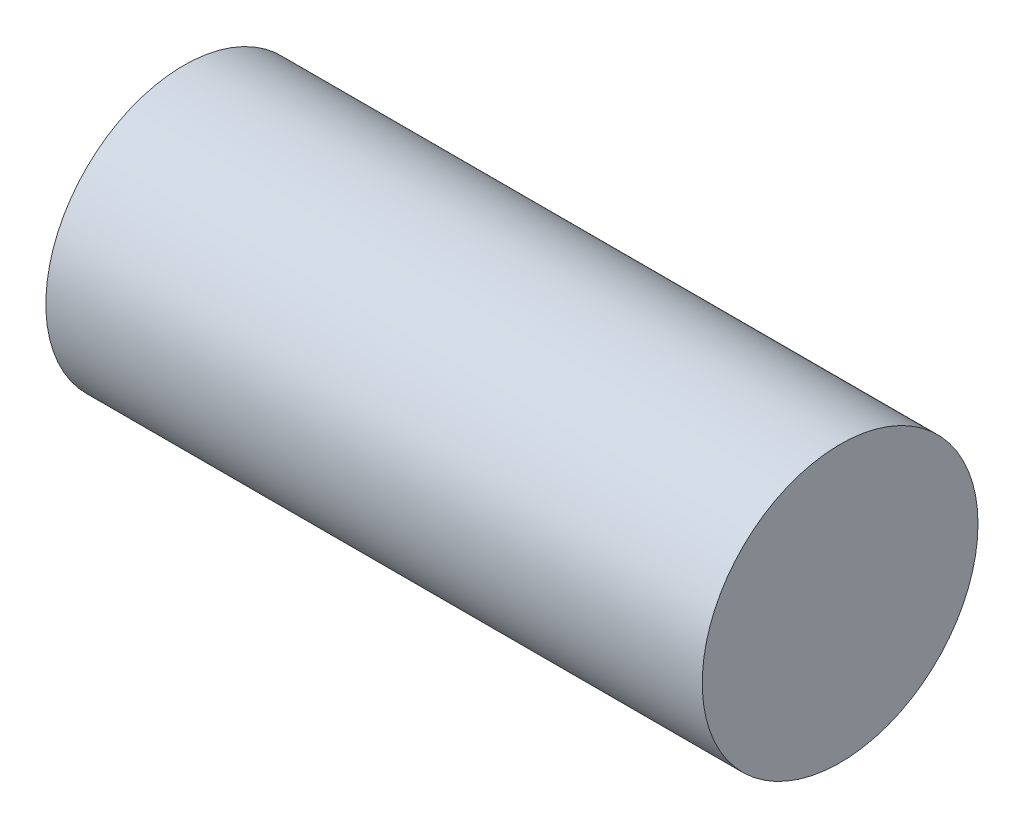
ISO-10303-21;
HEADER;
FILE_DESCRIPTION(('STEP AP214'),'2;1');
FILE_NAME('part.step','',(''),(''),'','','');
FILE_SCHEMA(('AUTOMOTIVE_DESIGN { 1 0 10303 214 1 1 1 1 }'));
ENDSEC;
DATA;
#1=APPLICATION_CONTEXT('core data for automotive mechanical design processes');
#2=APPLICATION_PROTOCOL_DEFINITION('international standard','automotive_design',2000,#1);
#3=PRODUCT_CONTEXT('',#1,'mechanical');
#4=PRODUCT('Part','Part','',(#3));
#5=PRODUCT_RELATED_PRODUCT_CATEGORY('part','',(#4));
#6=PRODUCT_DEFINITION_FORMATION('','',#4);
#7=PRODUCT_DEFINITION_CONTEXT('part definition',#1,'design');
#8=PRODUCT_DEFINITION('design','',#6,#7);
#9=PRODUCT_DEFINITION_SHAPE('','',#8);
#10=(LENGTH_UNIT() NAMED_UNIT(*) SI_UNIT(.MILLI.,.METRE.));
#11=(NAMED_UNIT(*) PLANE_ANGLE_UNIT() SI_UNIT($,.RADIAN.));
#12=(NAMED_UNIT(*) SI_UNIT($,.STERADIAN.) SOLID_ANGLE_UNIT());
#13=UNCERTAINTY_MEASURE_WITH_UNIT(LENGTH_MEASURE(1.E-05),#10,'distance_accuracy_value','');
#14=(GEOMETRIC_REPRESENTATION_CONTEXT(3) GLOBAL_UNCERTAINTY_ASSIGNED_CONTEXT((#13)) GLOBAL_UNIT_ASSIGNED_CONTEXT((#10,
#11,#12)) REPRESENTATION_CONTEXT('',''));
#15=CARTESIAN_POINT('',(0.,0.,0.));
#16=DIRECTION('',(0.,0.,1.));
#17=DIRECTION('',(1.,0.,0.));
#18=AXIS2_PLACEMENT_3D('',#15,#16,#17);
#19=CARTESIAN_POINT('',(-38.558216,106.805984,-275.620988));
#20=DIRECTION('',(1.,0.,0.));
#21=DIRECTION('',(0.,0.,-1.));
#22=AXIS2_PLACEMENT_3D('',#19,#20,#21);
#23=CYLINDRICAL_SURFACE('',#22,8.09993675450289);
#24=CARTESIAN_POINT('',(-38.558216,106.805984,-275.620988));
#25=DIRECTION('',(1.,0.,0.));
#26=DIRECTION('',(0.,0.,-1.));
#27=AXIS2_PLACEMENT_3D('',#24,#25,#26);
#28=CIRCLE('',#27,8.09993675450289);
#29=CARTESIAN_POINT('',(-38.558216,106.805984,-283.720924754503));
#30=VERTEX_POINT('',#29);
#31=EDGE_CURVE('E10',#30,#30,#28,.T.);
#32=CARTESIAN_POINT('',(0.,106.805984,-275.620988));
#33=DIRECTION('',(1.,0.,0.));
#34=DIRECTION('',(0.,0.,-1.));
#35=AXIS2_PLACEMENT_3D('',#32,#33,#34);
#36=CIRCLE('',#35,8.09993675450289);
#37=CARTESIAN_POINT('',(0.,106.805984,-283.720924754503));
#38=VERTEX_POINT('',#37);
#39=EDGE_CURVE('E34',#38,#38,#36,.T.);
#40=CARTESIAN_POINT('',(-38.558216,106.805984,-283.720924754503));
#41=CARTESIAN_POINT('',(-38.1565679166667,106.805984,-283.720924754503));
#42=CARTESIAN_POINT('',(-37.7549198333333,106.805984,-283.720924754503));
#43=CARTESIAN_POINT('',(-36.9516236666667,106.805984,-283.720924754503));
#44=CARTESIAN_POINT('',(-36.5499755833333,106.805984,-283.720924754503));
#45=CARTESIAN_POINT('',(-35.7466794166667,106.805984,-283.720924754503));
#46=CARTESIAN_POINT('',(-35.3450313333333,106.805984,-283.720924754503));
#47=CARTESIAN_POINT('',(-34.5417351666667,106.805984,-283.720924754503));
#48=CARTESIAN_POINT('',(-34.1400870833333,106.805984,-283.720924754503));
#49=CARTESIAN_POINT('',(-33.3367909166667,106.805984,-283.720924754503));
#50=CARTESIAN_POINT('',(-32.9351428333333,106.805984,-283.720924754503));
#51=CARTESIAN_POINT('',(-32.1318466666667,106.805984,-283.720924754503));
#52=CARTESIAN_POINT('',(-31.7301985833333,106.805984,-283.720924754503));
#53=CARTESIAN_POINT('',(-30.9269024166667,106.805984,-283.720924754503));
#54=CARTESIAN_POINT('',(-30.5252543333333,106.805984,-283.720924754503));
#55=CARTESIAN_POINT('',(-29.7219581666667,106.805984,-283.720924754503));
#56=CARTESIAN_POINT('',(-29.3203100833333,106.805984,-283.720924754503));
#57=CARTESIAN_POINT('',(-28.5170139166667,106.805984,-283.720924754503));
#58=CARTESIAN_POINT('',(-28.1153658333333,106.805984,-283.720924754503));
#59=CARTESIAN_POINT('',(-27.3120696666667,106.805984,-283.720924754503));
#60=CARTESIAN_POINT('',(-26.9104215833333,106.805984,-283.720924754503));
#61=CARTESIAN_POINT('',(-26.1071254166667,106.805984,-283.720924754503));
#62=CARTESIAN_POINT('',(-25.7054773333333,106.805984,-283.720924754503));
#63=CARTESIAN_POINT('',(-24.9021811666667,106.805984,-283.720924754503));
#64=CARTESIAN_POINT('',(-24.5005330833333,106.805984,-283.720924754503));
#65=CARTESIAN_POINT('',(-23.6972369166667,106.805984,-283.720924754503));
#66=CARTESIAN_POINT('',(-23.2955888333333,106.805984,-283.720924754503));
#67=CARTESIAN_POINT('',(-22.4922926666667,106.805984,-283.720924754503));
#68=CARTESIAN_POINT('',(-22.0906445833333,106.805984,-283.720924754503));
#69=CARTESIAN_POINT('',(-21.2873484166667,106.805984,-283.720924754503));
#70=CARTESIAN_POINT('',(-20.8857003333333,106.805984,-283.720924754503));
#71=CARTESIAN_POINT('',(-20.0824041666667,106.805984,-283.720924754503));
#72=CARTESIAN_POINT('',(-19.6807560833333,106.805984,-283.720924754503));
#73=CARTESIAN_POINT('',(-18.8774599166667,106.805984,-283.720924754503));
#74=CARTESIAN_POINT('',(-18.4758118333333,106.805984,-283.720924754503));
#75=CARTESIAN_POINT('',(-17.6725156666667,106.805984,-283.720924754503));
#76=CARTESIAN_POINT('',(-17.2708675833333,106.805984,-283.720924754503));
#77=CARTESIAN_POINT('',(-16.4675714166667,106.805984,-283.720924754503));
#78=CARTESIAN_POINT('',(-16.0659233333333,106.805984,-283.720924754503));
#79=CARTESIAN_POINT('',(-15.2626271666667,106.805984,-283.720924754503));
#80=CARTESIAN_POINT('',(-14.8609790833333,106.805984,-283.720924754503));
#81=CARTESIAN_POINT('',(-14.0576829166667,106.805984,-283.720924754503));
#82=CARTESIAN_POINT('',(-13.6560348333333,106.805984,-283.720924754503));
#83=CARTESIAN_POINT('',(-12.8527386666667,106.805984,-283.720924754503));
#84=CARTESIAN_POINT('',(-12.4510905833333,106.805984,-283.720924754503));
#85=CARTESIAN_POINT('',(-11.6477944166667,106.805984,-283.720924754503));
#86=CARTESIAN_POINT('',(-11.2461463333333,106.805984,-283.720924754503));
#87=CARTESIAN_POINT('',(-10.4428501666667,106.805984,-283.720924754503));
#88=CARTESIAN_POINT('',(-10.0412020833333,106.805984,-283.720924754503));
#89=CARTESIAN_POINT('',(-9.23790591666666,106.805984,-283.720924754503));
#90=CARTESIAN_POINT('',(-8.83625783333333,106.805984,-283.720924754503));
#91=CARTESIAN_POINT('',(-8.03296166666667,106.805984,-283.720924754503));
#92=CARTESIAN_POINT('',(-7.63131358333333,106.805984,-283.720924754503));
#93=CARTESIAN_POINT('',(-6.82801741666667,106.805984,-283.720924754503));
#94=CARTESIAN_POINT('',(-6.42636933333334,106.805984,-283.720924754503));
#95=CARTESIAN_POINT('',(-5.62307316666667,106.805984,-283.720924754503));
#96=CARTESIAN_POINT('',(-5.22142508333334,106.805984,-283.720924754503));
#97=CARTESIAN_POINT('',(-4.41812891666667,106.805984,-283.720924754503));
#98=CARTESIAN_POINT('',(-4.01648083333333,106.805984,-283.720924754503));
#99=CARTESIAN_POINT('',(-3.21318466666666,106.805984,-283.720924754503));
#100=CARTESIAN_POINT('',(-2.81153658333333,106.805984,-283.720924754503));
#101=CARTESIAN_POINT('',(-2.00824041666667,106.805984,-283.720924754503));
#102=CARTESIAN_POINT('',(-1.60659233333333,106.805984,-283.720924754503));
#103=CARTESIAN_POINT('',(-0.803296166666666,106.805984,-283.720924754503));
#104=CARTESIAN_POINT('',(-0.401648083333333,106.805984,-283.720924754503));
#105=CARTESIAN_POINT('',(0.,106.805984,-283.720924754503));
#106=B_SPLINE_CURVE_WITH_KNOTS('',3,(#40,#41,#42,#43,#44,#45,#46,#47,#48,#49,#50,#51,#52,#53,
#54,#55,#56,#57,#58,#59,#60,#61,#62,#63,#64,#65,#66,#67,#68,#69,#70,#71,#72,#73,#74,#75,#76,#77,
#78,#79,#80,#81,#82,#83,#84,#85,#86,#87,#88,#89,#90,#91,#92,#93,#94,#95,#96,#97,#98,#99,#100,
#101,#102,#103,#104,#105),.UNSPECIFIED.,.F.,.F.,(4,2,2,2,2,2,2,2,2,2,2,2,2,2,2,2,2,2,2,2,2,2,2,
2,2,2,2,2,2,2,2,2,4),(0.,1.20494425000001,2.40988850000001,3.61483275000001,4.819777,6.02472125,
7.2296655,8.43460975,9.63955400000001,10.84449825,12.0494425,13.25438675,14.459331,15.66427525,
16.8692195,18.07416375,19.279108,20.48405225,21.6889965,22.89394075,24.098885,25.30382925,
26.5087735,27.71371775,28.918662,30.12360625,31.3285505,32.53349475,33.738439,34.94338325,
36.1483275,37.35327175,38.558216),.UNSPECIFIED.);
#107=EDGE_CURVE('BSEAM31',#30,#38,#106,.T.);
#108=ORIENTED_EDGE('',*,*,#31,.T.);
#109=ORIENTED_EDGE('',*,*,#39,.F.);
#110=ORIENTED_EDGE('',*,*,#107,.T.);
#111=ORIENTED_EDGE('',*,*,#107,.F.);
#112=EDGE_LOOP('',(#108,#110,#109,#111));
#113=FACE_BOUND('',#112,.T.);
#114=ADVANCED_FACE('F31',(#113),#23,.T.);
#115=CARTESIAN_POINT('',(-38.558216,106.805984,-275.620988));
#116=DIRECTION('',(1.,0.,0.));
#117=DIRECTION('',(0.,0.,-1.));
#118=AXIS2_PLACEMENT_3D('',#115,#116,#117);
#119=PLANE('',#118);
#120=ORIENTED_EDGE('',*,*,#31,.F.);
#121=EDGE_LOOP('',(#120));
#122=FACE_BOUND('',#121,.T.);
#123=ADVANCED_FACE('F46',(#122),#119,.F.);
#124=CARTESIAN_POINT('',(0.,106.805984,-275.620988));
#125=DIRECTION('',(1.,0.,0.));
#126=DIRECTION('',(0.,0.,-1.));
#127=AXIS2_PLACEMENT_3D('',#124,#125,#126);
#128=PLANE('',#127);
#129=ORIENTED_EDGE('',*,*,#39,.T.);
#130=EDGE_LOOP('',(#129));
#131=FACE_BOUND('',#130,.T.);
#132=ADVANCED_FACE('F43',(#131),#128,.T.);
#133=CLOSED_SHELL('',(#114,#123,#132));
#134=MANIFOLD_SOLID_BREP('B2',#133);
#135=ADVANCED_BREP_SHAPE_REPRESENTATION('',(#18,#134),#14);
#136=SHAPE_DEFINITION_REPRESENTATION(#9,#135);
ENDSEC;
END-ISO-10303-21;
